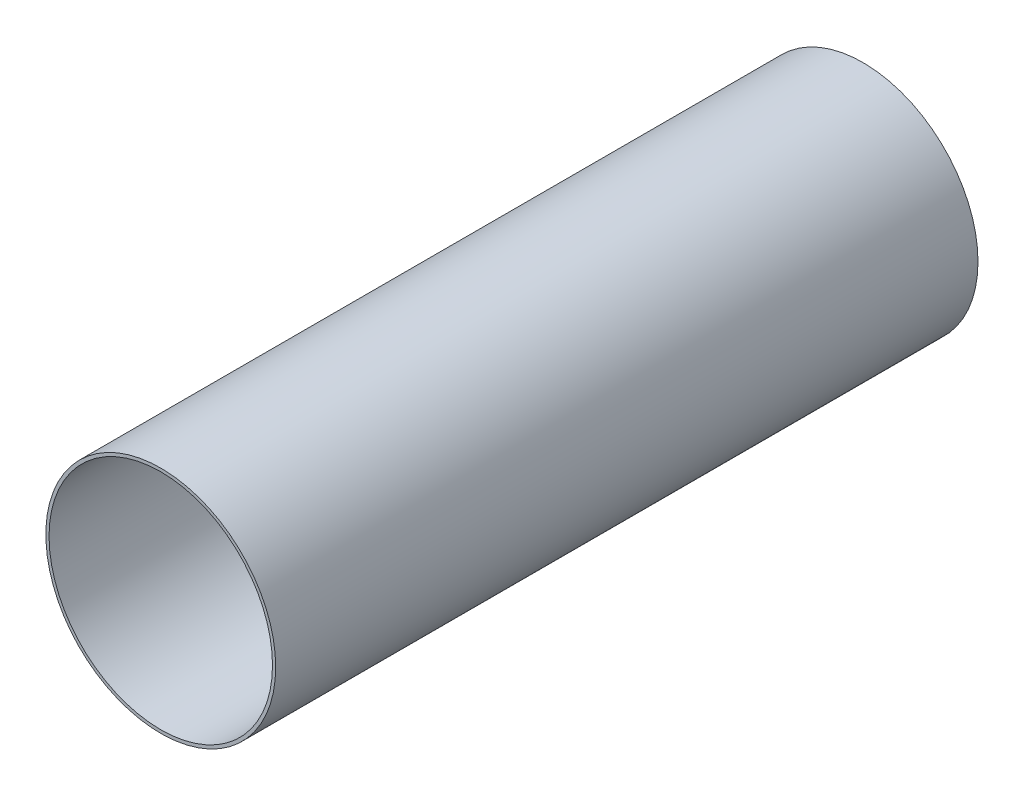
ISO-10303-21;
HEADER;
FILE_DESCRIPTION(('STEP AP214'),'2;1');
FILE_NAME('part.step','',(''),(''),'','','');
FILE_SCHEMA(('AUTOMOTIVE_DESIGN { 1 0 10303 214 1 1 1 1 }'));
ENDSEC;
DATA;
#1=APPLICATION_CONTEXT('core data for automotive mechanical design processes');
#2=APPLICATION_PROTOCOL_DEFINITION('international standard','automotive_design',2000,#1);
#3=PRODUCT_CONTEXT('',#1,'mechanical');
#4=PRODUCT('Part','Part','',(#3));
#5=PRODUCT_RELATED_PRODUCT_CATEGORY('part','',(#4));
#6=PRODUCT_DEFINITION_FORMATION('','',#4);
#7=PRODUCT_DEFINITION_CONTEXT('part definition',#1,'design');
#8=PRODUCT_DEFINITION('design','',#6,#7);
#9=PRODUCT_DEFINITION_SHAPE('','',#8);
#10=(LENGTH_UNIT() NAMED_UNIT(*) SI_UNIT(.MILLI.,.METRE.));
#11=(NAMED_UNIT(*) PLANE_ANGLE_UNIT() SI_UNIT($,.RADIAN.));
#12=(NAMED_UNIT(*) SI_UNIT($,.STERADIAN.) SOLID_ANGLE_UNIT());
#13=UNCERTAINTY_MEASURE_WITH_UNIT(LENGTH_MEASURE(1.E-05),#10,'distance_accuracy_value','');
#14=(GEOMETRIC_REPRESENTATION_CONTEXT(3) GLOBAL_UNCERTAINTY_ASSIGNED_CONTEXT((#13)) GLOBAL_UNIT_ASSIGNED_CONTEXT((#10,
#11,#12)) REPRESENTATION_CONTEXT('',''));
#15=CARTESIAN_POINT('',(0.,0.,0.));
#16=DIRECTION('',(0.,0.,1.));
#17=DIRECTION('',(1.,0.,0.));
#18=AXIS2_PLACEMENT_3D('',#15,#16,#17);
#19=CARTESIAN_POINT('',(0.,0.,220.));
#20=DIRECTION('',(0.,0.,1.));
#21=DIRECTION('',(1.,0.,0.));
#22=AXIS2_PLACEMENT_3D('',#19,#20,#21);
#23=PLANE('',#22);
#24=CARTESIAN_POINT('',(0.,0.,220.));
#25=DIRECTION('',(0.,0.,1.));
#26=DIRECTION('',(1.,0.,0.));
#27=AXIS2_PLACEMENT_3D('',#24,#25,#26);
#28=CIRCLE('',#27,36.);
#29=CARTESIAN_POINT('',(36.,0.,220.));
#30=VERTEX_POINT('',#29);
#31=EDGE_CURVE('E10',#30,#30,#28,.T.);
#32=ORIENTED_EDGE('',*,*,#31,.T.);
#33=EDGE_LOOP('',(#32));
#34=FACE_BOUND('',#33,.T.);
#35=CARTESIAN_POINT('',(0.,0.,220.));
#36=DIRECTION('',(0.,0.,1.));
#37=DIRECTION('',(1.,0.,0.));
#38=AXIS2_PLACEMENT_3D('',#35,#36,#37);
#39=CIRCLE('',#38,35.);
#40=CARTESIAN_POINT('',(35.,0.,220.));
#41=VERTEX_POINT('',#40);
#42=EDGE_CURVE('E56',#41,#41,#39,.T.);
#43=ORIENTED_EDGE('',*,*,#42,.F.);
#44=EDGE_LOOP('',(#43));
#45=FACE_BOUND('',#44,.T.);
#46=ADVANCED_FACE('F43',(#34,#45),#23,.T.);
#47=CARTESIAN_POINT('',(0.,0.,0.));
#48=DIRECTION('',(0.,0.,1.));
#49=DIRECTION('',(1.,0.,0.));
#50=AXIS2_PLACEMENT_3D('',#47,#48,#49);
#51=PLANE('',#50);
#52=CARTESIAN_POINT('',(0.,0.,0.));
#53=DIRECTION('',(0.,0.,1.));
#54=DIRECTION('',(1.,0.,0.));
#55=AXIS2_PLACEMENT_3D('',#52,#53,#54);
#56=CIRCLE('',#55,36.);
#57=CARTESIAN_POINT('',(36.,0.,0.));
#58=VERTEX_POINT('',#57);
#59=EDGE_CURVE('E47',#58,#58,#56,.T.);
#60=ORIENTED_EDGE('',*,*,#59,.F.);
#61=EDGE_LOOP('',(#60));
#62=FACE_BOUND('',#61,.T.);
#63=CARTESIAN_POINT('',(0.,0.,0.));
#64=DIRECTION('',(0.,0.,1.));
#65=DIRECTION('',(1.,0.,0.));
#66=AXIS2_PLACEMENT_3D('',#63,#64,#65);
#67=CIRCLE('',#66,35.);
#68=CARTESIAN_POINT('',(35.,0.,0.));
#69=VERTEX_POINT('',#68);
#70=EDGE_CURVE('E58',#69,#69,#67,.T.);
#71=ORIENTED_EDGE('',*,*,#70,.T.);
#72=EDGE_LOOP('',(#71));
#73=FACE_BOUND('',#72,.T.);
#74=ADVANCED_FACE('F70',(#62,#73),#51,.F.);
#75=CARTESIAN_POINT('',(0.,0.,220.));
#76=DIRECTION('',(0.,0.,-1.));
#77=DIRECTION('',(-1.,0.,0.));
#78=AXIS2_PLACEMENT_3D('',#75,#76,#77);
#79=CYLINDRICAL_SURFACE('',#78,36.);
#80=ORIENTED_EDGE('',*,*,#31,.F.);
#81=EDGE_LOOP('',(#80));
#82=FACE_BOUND('',#81,.T.);
#83=ORIENTED_EDGE('',*,*,#59,.T.);
#84=EDGE_LOOP('',(#83));
#85=FACE_BOUND('',#84,.T.);
#86=ADVANCED_FACE('F45',(#82,#85),#79,.T.);
#87=CARTESIAN_POINT('',(0.,0.,220.));
#88=DIRECTION('',(0.,0.,-1.));
#89=DIRECTION('',(-1.,0.,0.));
#90=AXIS2_PLACEMENT_3D('',#87,#88,#89);
#91=CYLINDRICAL_SURFACE('',#90,35.);
#92=ORIENTED_EDGE('',*,*,#42,.T.);
#93=EDGE_LOOP('',(#92));
#94=FACE_BOUND('',#93,.T.);
#95=ORIENTED_EDGE('',*,*,#70,.F.);
#96=EDGE_LOOP('',(#95));
#97=FACE_BOUND('',#96,.T.);
#98=ADVANCED_FACE('F66',(#94,#97),#91,.F.);
#99=CLOSED_SHELL('',(#46,#74,#86,#98));
#100=MANIFOLD_SOLID_BREP('B2',#99);
#101=ADVANCED_BREP_SHAPE_REPRESENTATION('',(#18,#100),#14);
#102=SHAPE_DEFINITION_REPRESENTATION(#9,#101);
ENDSEC;
END-ISO-10303-21;
